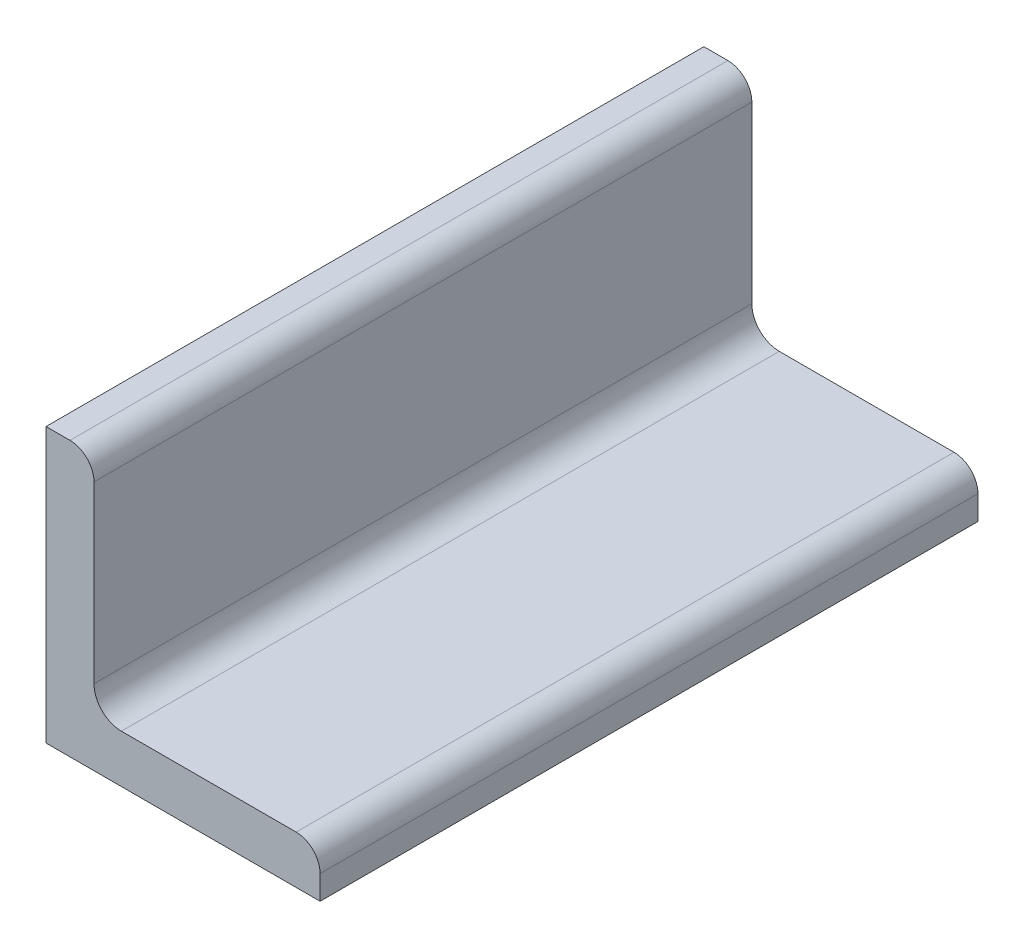
ISO-10303-21;
HEADER;
FILE_DESCRIPTION(('STEP AP214'),'2;1');
FILE_NAME('part.step','',(''),(''),'','','');
FILE_SCHEMA(('AUTOMOTIVE_DESIGN { 1 0 10303 214 1 1 1 1 }'));
ENDSEC;
DATA;
#1=APPLICATION_CONTEXT('core data for automotive mechanical design processes');
#2=APPLICATION_PROTOCOL_DEFINITION('international standard','automotive_design',2000,#1);
#3=PRODUCT_CONTEXT('',#1,'mechanical');
#4=PRODUCT('Part','Part','',(#3));
#5=PRODUCT_RELATED_PRODUCT_CATEGORY('part','',(#4));
#6=PRODUCT_DEFINITION_FORMATION('','',#4);
#7=PRODUCT_DEFINITION_CONTEXT('part definition',#1,'design');
#8=PRODUCT_DEFINITION('design','',#6,#7);
#9=PRODUCT_DEFINITION_SHAPE('','',#8);
#10=(LENGTH_UNIT() NAMED_UNIT(*) SI_UNIT(.MILLI.,.METRE.));
#11=(NAMED_UNIT(*) PLANE_ANGLE_UNIT() SI_UNIT($,.RADIAN.));
#12=(NAMED_UNIT(*) SI_UNIT($,.STERADIAN.) SOLID_ANGLE_UNIT());
#13=UNCERTAINTY_MEASURE_WITH_UNIT(LENGTH_MEASURE(1.E-05),#10,'distance_accuracy_value','');
#14=(GEOMETRIC_REPRESENTATION_CONTEXT(3) GLOBAL_UNCERTAINTY_ASSIGNED_CONTEXT((#13)) GLOBAL_UNIT_ASSIGNED_CONTEXT((#10,
#11,#12)) REPRESENTATION_CONTEXT('',''));
#15=CARTESIAN_POINT('',(0.,0.,0.));
#16=DIRECTION('',(0.,0.,1.));
#17=DIRECTION('',(1.,0.,0.));
#18=AXIS2_PLACEMENT_3D('',#15,#16,#17);
#19=CARTESIAN_POINT('',(0.0507450451214936,127.041655270204,304.8));
#20=DIRECTION('',(1.,0.,0.));
#21=DIRECTION('',(0.,0.,-1.));
#22=AXIS2_PLACEMENT_3D('',#19,#20,#21);
#23=PLANE('',#22);
#24=DIRECTION('',(0.,-1.,0.));
#25=VECTOR('',#24,1.);
#26=CARTESIAN_POINT('',(0.0507450451214936,127.041655270204,0.));
#27=LINE('',#26,#25);
#28=CARTESIAN_POINT('',(0.0507450451214936,127.041655270204,0.));
#29=VERTEX_POINT('',#28);
#30=CARTESIAN_POINT('',(0.0507450451214936,0.0416552702040917,0.));
#31=VERTEX_POINT('',#30);
#32=EDGE_CURVE('E135',#29,#31,#27,.T.);
#33=ORIENTED_EDGE('',*,*,#32,.T.);
#34=DIRECTION('',(0.,0.,-1.));
#35=VECTOR('',#34,1.);
#36=CARTESIAN_POINT('',(0.0507450451214936,0.0416552702040917,304.8));
#37=LINE('',#36,#35);
#38=CARTESIAN_POINT('',(0.0507450451214936,0.0416552702040917,304.8));
#39=VERTEX_POINT('',#38);
#40=EDGE_CURVE('E11',#39,#31,#37,.T.);
#41=ORIENTED_EDGE('',*,*,#40,.F.);
#42=DIRECTION('',(0.,-1.,0.));
#43=VECTOR('',#42,1.);
#44=CARTESIAN_POINT('',(0.0507450451214936,127.041655270204,304.8));
#45=LINE('',#44,#43);
#46=CARTESIAN_POINT('',(0.0507450451214936,127.041655270204,304.8));
#47=VERTEX_POINT('',#46);
#48=EDGE_CURVE('E151',#47,#39,#45,.T.);
#49=ORIENTED_EDGE('',*,*,#48,.F.);
#50=DIRECTION('',(0.,0.,-1.));
#51=VECTOR('',#50,1.);
#52=CARTESIAN_POINT('',(0.0507450451214936,127.041655270204,304.8));
#53=LINE('',#52,#51);
#54=EDGE_CURVE('E131',#47,#29,#53,.T.);
#55=ORIENTED_EDGE('',*,*,#54,.T.);
#56=EDGE_LOOP('',(#33,#41,#49,#55));
#57=FACE_BOUND('',#56,.T.);
#58=ADVANCED_FACE('F33',(#57),#23,.F.);
#59=CARTESIAN_POINT('',(0.0507450451214936,0.0416552702040917,304.8));
#60=DIRECTION('',(0.,1.,0.));
#61=DIRECTION('',(0.,0.,1.));
#62=AXIS2_PLACEMENT_3D('',#59,#60,#61);
#63=PLANE('',#62);
#64=DIRECTION('',(1.,0.,0.));
#65=VECTOR('',#64,1.);
#66=CARTESIAN_POINT('',(0.0507450451214936,0.0416552702040917,0.));
#67=LINE('',#66,#65);
#68=CARTESIAN_POINT('',(127.050745045121,0.0416552702040917,0.));
#69=VERTEX_POINT('',#68);
#70=EDGE_CURVE('E138',#31,#69,#67,.T.);
#71=ORIENTED_EDGE('',*,*,#70,.T.);
#72=DIRECTION('',(0.,0.,-1.));
#73=VECTOR('',#72,1.);
#74=CARTESIAN_POINT('',(127.050745045121,0.0416552702040917,304.8));
#75=LINE('',#74,#73);
#76=CARTESIAN_POINT('',(127.050745045121,0.0416552702040917,304.8));
#77=VERTEX_POINT('',#76);
#78=EDGE_CURVE('E41',#77,#69,#75,.T.);
#79=ORIENTED_EDGE('',*,*,#78,.F.);
#80=DIRECTION('',(1.,0.,0.));
#81=VECTOR('',#80,1.);
#82=CARTESIAN_POINT('',(0.0507450451214936,0.0416552702040917,304.8));
#83=LINE('',#82,#81);
#84=EDGE_CURVE('E95',#39,#77,#83,.T.);
#85=ORIENTED_EDGE('',*,*,#84,.F.);
#86=ORIENTED_EDGE('',*,*,#40,.T.);
#87=EDGE_LOOP('',(#71,#79,#85,#86));
#88=FACE_BOUND('',#87,.T.);
#89=ADVANCED_FACE('F194',(#88),#63,.F.);
#90=CARTESIAN_POINT('',(127.050745045121,0.0416552702040917,304.8));
#91=DIRECTION('',(-1.,0.,0.));
#92=DIRECTION('',(0.,0.,1.));
#93=AXIS2_PLACEMENT_3D('',#90,#91,#92);
#94=PLANE('',#93);
#95=DIRECTION('',(0.,1.,0.));
#96=VECTOR('',#95,1.);
#97=CARTESIAN_POINT('',(127.050745045121,0.0416552702040917,0.));
#98=LINE('',#97,#96);
#99=CARTESIAN_POINT('',(127.050745045121,11.1541552702041,0.));
#100=VERTEX_POINT('',#99);
#101=EDGE_CURVE('E140',#69,#100,#98,.T.);
#102=ORIENTED_EDGE('',*,*,#101,.T.);
#103=DIRECTION('',(0.,0.,-1.));
#104=VECTOR('',#103,1.);
#105=CARTESIAN_POINT('',(127.050745045121,11.1541552702041,304.8));
#106=LINE('',#105,#104);
#107=CARTESIAN_POINT('',(127.050745045121,11.1541552702041,304.8));
#108=VERTEX_POINT('',#107);
#109=EDGE_CURVE('E161',#108,#100,#106,.T.);
#110=ORIENTED_EDGE('',*,*,#109,.F.);
#111=DIRECTION('',(0.,1.,0.));
#112=VECTOR('',#111,1.);
#113=CARTESIAN_POINT('',(127.050745045121,0.0416552702040917,304.8));
#114=LINE('',#113,#112);
#115=EDGE_CURVE('E169',#77,#108,#114,.T.);
#116=ORIENTED_EDGE('',*,*,#115,.F.);
#117=ORIENTED_EDGE('',*,*,#78,.T.);
#118=EDGE_LOOP('',(#102,#110,#116,#117));
#119=FACE_BOUND('',#118,.T.);
#120=ADVANCED_FACE('F167',(#119),#94,.F.);
#121=CARTESIAN_POINT('',(115.938245045121,11.1541552702041,304.8));
#122=DIRECTION('',(0.,0.,-1.));
#123=DIRECTION('',(-1.,0.,0.));
#124=AXIS2_PLACEMENT_3D('',#121,#122,#123);
#125=CYLINDRICAL_SURFACE('',#124,11.1125);
#126=CARTESIAN_POINT('',(115.938245045121,11.1541552702041,0.));
#127=DIRECTION('',(0.,0.,1.));
#128=DIRECTION('',(1.,0.,0.));
#129=AXIS2_PLACEMENT_3D('',#126,#127,#128);
#130=CIRCLE('',#129,11.1125);
#131=CARTESIAN_POINT('',(115.938245045121,22.2666552702041,0.));
#132=VERTEX_POINT('',#131);
#133=EDGE_CURVE('E142',#100,#132,#130,.T.);
#134=ORIENTED_EDGE('',*,*,#133,.T.);
#135=DIRECTION('',(0.,0.,-1.));
#136=VECTOR('',#135,1.);
#137=CARTESIAN_POINT('',(115.938245045121,22.2666552702041,304.8));
#138=LINE('',#137,#136);
#139=CARTESIAN_POINT('',(115.938245045121,22.2666552702041,304.8));
#140=VERTEX_POINT('',#139);
#141=EDGE_CURVE('E158',#140,#132,#138,.T.);
#142=ORIENTED_EDGE('',*,*,#141,.F.);
#143=CARTESIAN_POINT('',(115.938245045121,11.1541552702041,304.8));
#144=DIRECTION('',(0.,0.,1.));
#145=DIRECTION('',(1.,0.,0.));
#146=AXIS2_PLACEMENT_3D('',#143,#144,#145);
#147=CIRCLE('',#146,11.1125);
#148=EDGE_CURVE('E185',#108,#140,#147,.T.);
#149=ORIENTED_EDGE('',*,*,#148,.F.);
#150=ORIENTED_EDGE('',*,*,#109,.T.);
#151=EDGE_LOOP('',(#134,#142,#149,#150));
#152=FACE_BOUND('',#151,.T.);
#153=ADVANCED_FACE('F178',(#152),#125,.T.);
#154=CARTESIAN_POINT('',(115.938245045121,22.2666552702041,304.8));
#155=DIRECTION('',(0.,-1.,0.));
#156=DIRECTION('',(0.,0.,-1.));
#157=AXIS2_PLACEMENT_3D('',#154,#155,#156);
#158=PLANE('',#157);
#159=DIRECTION('',(-1.,0.,0.));
#160=VECTOR('',#159,1.);
#161=CARTESIAN_POINT('',(115.938245045121,22.2666552702041,0.));
#162=LINE('',#161,#160);
#163=CARTESIAN_POINT('',(34.9757450451215,22.2666552702041,0.));
#164=VERTEX_POINT('',#163);
#165=EDGE_CURVE('E144',#132,#164,#162,.T.);
#166=ORIENTED_EDGE('',*,*,#165,.T.);
#167=DIRECTION('',(0.,0.,-1.));
#168=VECTOR('',#167,1.);
#169=CARTESIAN_POINT('',(34.9757450451215,22.2666552702041,304.8));
#170=LINE('',#169,#168);
#171=CARTESIAN_POINT('',(34.9757450451215,22.2666552702041,304.8));
#172=VERTEX_POINT('',#171);
#173=EDGE_CURVE('E155',#172,#164,#170,.T.);
#174=ORIENTED_EDGE('',*,*,#173,.F.);
#175=DIRECTION('',(-1.,0.,0.));
#176=VECTOR('',#175,1.);
#177=CARTESIAN_POINT('',(115.938245045121,22.2666552702041,304.8));
#178=LINE('',#177,#176);
#179=EDGE_CURVE('E184',#140,#172,#178,.T.);
#180=ORIENTED_EDGE('',*,*,#179,.F.);
#181=ORIENTED_EDGE('',*,*,#141,.T.);
#182=EDGE_LOOP('',(#166,#174,#180,#181));
#183=FACE_BOUND('',#182,.T.);
#184=ADVANCED_FACE('F182',(#183),#158,.F.);
#185=CARTESIAN_POINT('',(34.9757450451215,34.9666552702041,304.8));
#186=DIRECTION('',(0.,0.,-1.));
#187=DIRECTION('',(-1.,0.,0.));
#188=AXIS2_PLACEMENT_3D('',#185,#186,#187);
#189=CYLINDRICAL_SURFACE('',#188,12.7);
#190=CARTESIAN_POINT('',(34.9757450451215,34.9666552702041,0.));
#191=DIRECTION('',(0.,0.,-1.));
#192=DIRECTION('',(1.,0.,0.));
#193=AXIS2_PLACEMENT_3D('',#190,#191,#192);
#194=CIRCLE('',#193,12.7);
#195=CARTESIAN_POINT('',(22.2757450451215,34.9666552702041,0.));
#196=VERTEX_POINT('',#195);
#197=EDGE_CURVE('E146',#164,#196,#194,.T.);
#198=ORIENTED_EDGE('',*,*,#197,.T.);
#199=DIRECTION('',(0.,0.,-1.));
#200=VECTOR('',#199,1.);
#201=CARTESIAN_POINT('',(22.2757450451215,34.9666552702041,304.8));
#202=LINE('',#201,#200);
#203=CARTESIAN_POINT('',(22.2757450451215,34.9666552702041,304.8));
#204=VERTEX_POINT('',#203);
#205=EDGE_CURVE('E126',#204,#196,#202,.T.);
#206=ORIENTED_EDGE('',*,*,#205,.F.);
#207=CARTESIAN_POINT('',(34.9757450451215,34.9666552702041,304.8));
#208=DIRECTION('',(0.,0.,-1.));
#209=DIRECTION('',(1.,0.,0.));
#210=AXIS2_PLACEMENT_3D('',#207,#208,#209);
#211=CIRCLE('',#210,12.7);
#212=EDGE_CURVE('E117',#172,#204,#211,.T.);
#213=ORIENTED_EDGE('',*,*,#212,.F.);
#214=ORIENTED_EDGE('',*,*,#173,.T.);
#215=EDGE_LOOP('',(#198,#206,#213,#214));
#216=FACE_BOUND('',#215,.T.);
#217=ADVANCED_FACE('F206',(#216),#189,.F.);
#218=CARTESIAN_POINT('',(22.2757450451215,34.9666552702041,304.8));
#219=DIRECTION('',(-1.,0.,0.));
#220=DIRECTION('',(0.,0.,1.));
#221=AXIS2_PLACEMENT_3D('',#218,#219,#220);
#222=PLANE('',#221);
#223=DIRECTION('',(0.,1.,0.));
#224=VECTOR('',#223,1.);
#225=CARTESIAN_POINT('',(22.2757450451215,34.9666552702041,0.));
#226=LINE('',#225,#224);
#227=CARTESIAN_POINT('',(22.2757450451215,115.929155270204,0.));
#228=VERTEX_POINT('',#227);
#229=EDGE_CURVE('E125',#196,#228,#226,.T.);
#230=ORIENTED_EDGE('',*,*,#229,.T.);
#231=DIRECTION('',(0.,0.,-1.));
#232=VECTOR('',#231,1.);
#233=CARTESIAN_POINT('',(22.2757450451215,115.929155270204,304.8));
#234=LINE('',#233,#232);
#235=CARTESIAN_POINT('',(22.2757450451215,115.929155270204,304.8));
#236=VERTEX_POINT('',#235);
#237=EDGE_CURVE('E122',#236,#228,#234,.T.);
#238=ORIENTED_EDGE('',*,*,#237,.F.);
#239=DIRECTION('',(0.,1.,0.));
#240=VECTOR('',#239,1.);
#241=CARTESIAN_POINT('',(22.2757450451215,34.9666552702041,304.8));
#242=LINE('',#241,#240);
#243=EDGE_CURVE('E111',#204,#236,#242,.T.);
#244=ORIENTED_EDGE('',*,*,#243,.F.);
#245=ORIENTED_EDGE('',*,*,#205,.T.);
#246=EDGE_LOOP('',(#230,#238,#244,#245));
#247=FACE_BOUND('',#246,.T.);
#248=ADVANCED_FACE('F123',(#247),#222,.F.);
#249=CARTESIAN_POINT('',(11.1632450451215,115.929155270204,304.8));
#250=DIRECTION('',(0.,0.,-1.));
#251=DIRECTION('',(-1.,0.,0.));
#252=AXIS2_PLACEMENT_3D('',#249,#250,#251);
#253=CYLINDRICAL_SURFACE('',#252,11.1125);
#254=CARTESIAN_POINT('',(11.1632450451215,115.929155270204,0.));
#255=DIRECTION('',(0.,0.,1.));
#256=DIRECTION('',(1.,0.,0.));
#257=AXIS2_PLACEMENT_3D('',#254,#255,#256);
#258=CIRCLE('',#257,11.1125);
#259=CARTESIAN_POINT('',(11.1632450451215,127.041655270204,0.));
#260=VERTEX_POINT('',#259);
#261=EDGE_CURVE('E81',#228,#260,#258,.T.);
#262=ORIENTED_EDGE('',*,*,#261,.T.);
#263=DIRECTION('',(0.,0.,-1.));
#264=VECTOR('',#263,1.);
#265=CARTESIAN_POINT('',(11.1632450451215,127.041655270204,304.8));
#266=LINE('',#265,#264);
#267=CARTESIAN_POINT('',(11.1632450451215,127.041655270204,304.8));
#268=VERTEX_POINT('',#267);
#269=EDGE_CURVE('E127',#268,#260,#266,.T.);
#270=ORIENTED_EDGE('',*,*,#269,.F.);
#271=CARTESIAN_POINT('',(11.1632450451215,115.929155270204,304.8));
#272=DIRECTION('',(0.,0.,1.));
#273=DIRECTION('',(1.,0.,0.));
#274=AXIS2_PLACEMENT_3D('',#271,#272,#273);
#275=CIRCLE('',#274,11.1125);
#276=EDGE_CURVE('E115',#236,#268,#275,.T.);
#277=ORIENTED_EDGE('',*,*,#276,.F.);
#278=ORIENTED_EDGE('',*,*,#237,.T.);
#279=EDGE_LOOP('',(#262,#270,#277,#278));
#280=FACE_BOUND('',#279,.T.);
#281=ADVANCED_FACE('F129',(#280),#253,.T.);
#282=CARTESIAN_POINT('',(11.1632450451215,127.041655270204,304.8));
#283=DIRECTION('',(0.,-1.,0.));
#284=DIRECTION('',(0.,0.,-1.));
#285=AXIS2_PLACEMENT_3D('',#282,#283,#284);
#286=PLANE('',#285);
#287=DIRECTION('',(-1.,0.,0.));
#288=VECTOR('',#287,1.);
#289=CARTESIAN_POINT('',(11.1632450451215,127.041655270204,0.));
#290=LINE('',#289,#288);
#291=EDGE_CURVE('E87',#260,#29,#290,.T.);
#292=ORIENTED_EDGE('',*,*,#291,.T.);
#293=ORIENTED_EDGE('',*,*,#54,.F.);
#294=DIRECTION('',(-1.,0.,0.));
#295=VECTOR('',#294,1.);
#296=CARTESIAN_POINT('',(11.1632450451215,127.041655270204,304.8));
#297=LINE('',#296,#295);
#298=EDGE_CURVE('E49',#268,#47,#297,.T.);
#299=ORIENTED_EDGE('',*,*,#298,.F.);
#300=ORIENTED_EDGE('',*,*,#269,.T.);
#301=EDGE_LOOP('',(#292,#293,#299,#300));
#302=FACE_BOUND('',#301,.T.);
#303=ADVANCED_FACE('F214',(#302),#286,.F.);
#304=CARTESIAN_POINT('',(115.938245045121,11.1541552702041,304.8));
#305=DIRECTION('',(0.,0.,1.));
#306=DIRECTION('',(1.,0.,0.));
#307=AXIS2_PLACEMENT_3D('',#304,#305,#306);
#308=PLANE('',#307);
#309=ORIENTED_EDGE('',*,*,#48,.T.);
#310=ORIENTED_EDGE('',*,*,#84,.T.);
#311=ORIENTED_EDGE('',*,*,#115,.T.);
#312=ORIENTED_EDGE('',*,*,#148,.T.);
#313=ORIENTED_EDGE('',*,*,#179,.T.);
#314=ORIENTED_EDGE('',*,*,#212,.T.);
#315=ORIENTED_EDGE('',*,*,#243,.T.);
#316=ORIENTED_EDGE('',*,*,#276,.T.);
#317=ORIENTED_EDGE('',*,*,#298,.T.);
#318=EDGE_LOOP('',(#309,#310,#311,#312,#313,#314,#315,#316,#317));
#319=FACE_BOUND('',#318,.T.);
#320=ADVANCED_FACE('F113',(#319),#308,.T.);
#321=CARTESIAN_POINT('',(115.938245045121,11.1541552702041,0.));
#322=DIRECTION('',(0.,0.,1.));
#323=DIRECTION('',(1.,0.,0.));
#324=AXIS2_PLACEMENT_3D('',#321,#322,#323);
#325=PLANE('',#324);
#326=ORIENTED_EDGE('',*,*,#32,.F.);
#327=ORIENTED_EDGE('',*,*,#291,.F.);
#328=ORIENTED_EDGE('',*,*,#261,.F.);
#329=ORIENTED_EDGE('',*,*,#229,.F.);
#330=ORIENTED_EDGE('',*,*,#197,.F.);
#331=ORIENTED_EDGE('',*,*,#165,.F.);
#332=ORIENTED_EDGE('',*,*,#133,.F.);
#333=ORIENTED_EDGE('',*,*,#101,.F.);
#334=ORIENTED_EDGE('',*,*,#70,.F.);
#335=EDGE_LOOP('',(#326,#327,#328,#329,#330,#331,#332,#333,#334));
#336=FACE_BOUND('',#335,.T.);
#337=ADVANCED_FACE('F173',(#336),#325,.F.);
#338=CLOSED_SHELL('',(#58,#89,#120,#153,#184,#217,#248,#281,#303,#320,#337));
#339=MANIFOLD_SOLID_BREP('B2',#338);
#340=ADVANCED_BREP_SHAPE_REPRESENTATION('',(#18,#339),#14);
#341=SHAPE_DEFINITION_REPRESENTATION(#9,#340);
ENDSEC;
END-ISO-10303-21;
